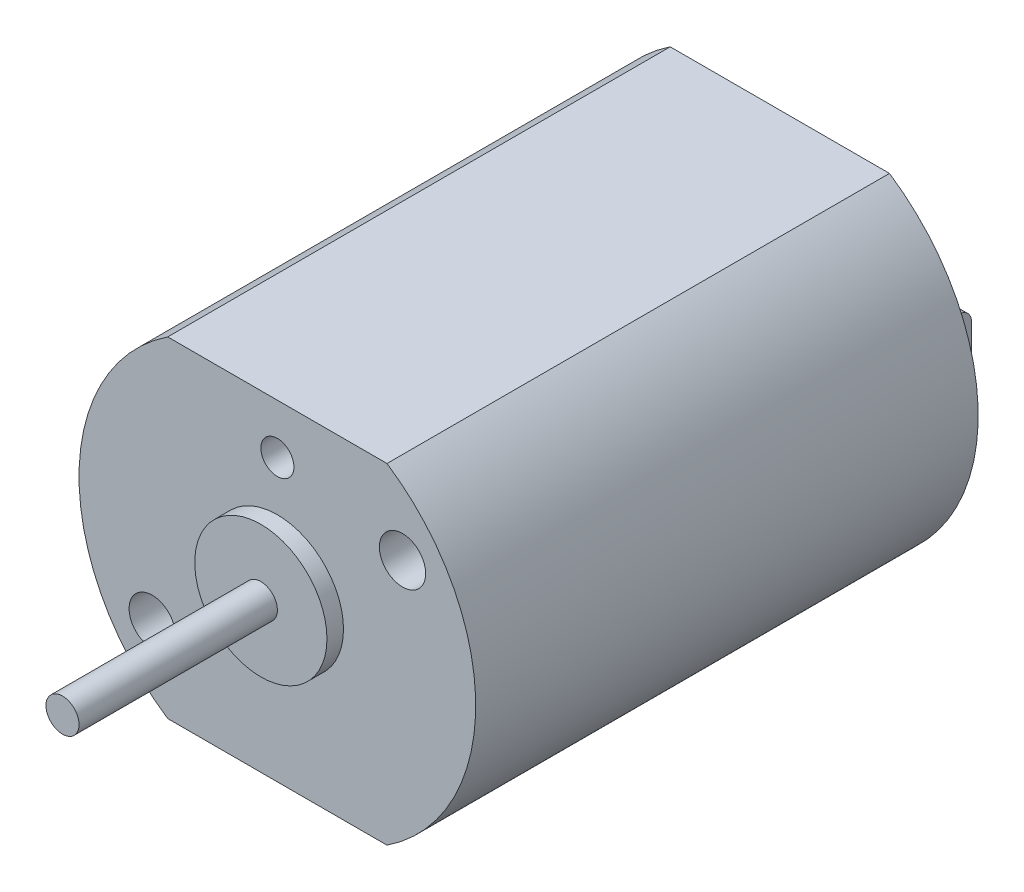
ISO-10303-21;
HEADER;
FILE_DESCRIPTION(('STEP AP214'),'2;1');
FILE_NAME('part.step','',(''),(''),'','','');
FILE_SCHEMA(('AUTOMOTIVE_DESIGN { 1 0 10303 214 1 1 1 1 }'));
ENDSEC;
DATA;
#1=APPLICATION_CONTEXT('core data for automotive mechanical design processes');
#2=APPLICATION_PROTOCOL_DEFINITION('international standard','automotive_design',2000,#1);
#3=PRODUCT_CONTEXT('',#1,'mechanical');
#4=PRODUCT('Part','Part','',(#3));
#5=PRODUCT_RELATED_PRODUCT_CATEGORY('part','',(#4));
#6=PRODUCT_DEFINITION_FORMATION('','',#4);
#7=PRODUCT_DEFINITION_CONTEXT('part definition',#1,'design');
#8=PRODUCT_DEFINITION('design','',#6,#7);
#9=PRODUCT_DEFINITION_SHAPE('','',#8);
#10=(LENGTH_UNIT() NAMED_UNIT(*) SI_UNIT(.MILLI.,.METRE.));
#11=(NAMED_UNIT(*) PLANE_ANGLE_UNIT() SI_UNIT($,.RADIAN.));
#12=(NAMED_UNIT(*) SI_UNIT($,.STERADIAN.) SOLID_ANGLE_UNIT());
#13=UNCERTAINTY_MEASURE_WITH_UNIT(LENGTH_MEASURE(1.E-05),#10,'distance_accuracy_value','');
#14=(GEOMETRIC_REPRESENTATION_CONTEXT(3) GLOBAL_UNCERTAINTY_ASSIGNED_CONTEXT((#13)) GLOBAL_UNIT_ASSIGNED_CONTEXT((#10,
#11,#12)) REPRESENTATION_CONTEXT('',''));
#15=CARTESIAN_POINT('',(0.,0.,0.));
#16=DIRECTION('',(0.,0.,1.));
#17=DIRECTION('',(1.,0.,0.));
#18=AXIS2_PLACEMENT_3D('',#15,#16,#17);
#19=CARTESIAN_POINT('',(0.,5.,15.2));
#20=DIRECTION('',(0.,1.,0.));
#21=DIRECTION('',(0.,0.,1.));
#22=AXIS2_PLACEMENT_3D('',#19,#20,#21);
#23=PLANE('',#22);
#24=DIRECTION('',(1.,0.,0.));
#25=VECTOR('',#24,1.);
#26=CARTESIAN_POINT('',(0.,5.,0.));
#27=LINE('',#26,#25);
#28=CARTESIAN_POINT('',(-3.3166247903554,5.,0.));
#29=VERTEX_POINT('',#28);
#30=CARTESIAN_POINT('',(3.3166247903554,5.,0.));
#31=VERTEX_POINT('',#30);
#32=EDGE_CURVE('E311',#29,#31,#27,.T.);
#33=ORIENTED_EDGE('',*,*,#32,.F.);
#34=DIRECTION('',(0.,0.,-1.));
#35=VECTOR('',#34,1.);
#36=CARTESIAN_POINT('',(-3.3166247903554,5.,15.2));
#37=LINE('',#36,#35);
#38=CARTESIAN_POINT('',(-3.3166247903554,5.,15.2));
#39=VERTEX_POINT('',#38);
#40=EDGE_CURVE('E340',#39,#29,#37,.T.);
#41=ORIENTED_EDGE('',*,*,#40,.F.);
#42=DIRECTION('',(1.,0.,0.));
#43=VECTOR('',#42,1.);
#44=CARTESIAN_POINT('',(0.,5.,15.2));
#45=LINE('',#44,#43);
#46=CARTESIAN_POINT('',(3.3166247903554,5.,15.2));
#47=VERTEX_POINT('',#46);
#48=EDGE_CURVE('E317',#39,#47,#45,.T.);
#49=ORIENTED_EDGE('',*,*,#48,.T.);
#50=DIRECTION('',(0.,0.,-1.));
#51=VECTOR('',#50,1.);
#52=CARTESIAN_POINT('',(3.3166247903554,5.,15.2));
#53=LINE('',#52,#51);
#54=EDGE_CURVE('E332',#47,#31,#53,.T.);
#55=ORIENTED_EDGE('',*,*,#54,.T.);
#56=EDGE_LOOP('',(#33,#41,#49,#55));
#57=FACE_BOUND('',#56,.T.);
#58=ADVANCED_FACE('F39',(#57),#23,.T.);
#59=CARTESIAN_POINT('',(0.,0.,15.2));
#60=DIRECTION('',(0.,0.,-1.));
#61=DIRECTION('',(-1.,0.,0.));
#62=AXIS2_PLACEMENT_3D('',#59,#60,#61);
#63=CYLINDRICAL_SURFACE('',#62,6.);
#64=CARTESIAN_POINT('',(0.,0.,0.));
#65=DIRECTION('',(0.,0.,1.));
#66=DIRECTION('',(1.,0.,0.));
#67=AXIS2_PLACEMENT_3D('',#64,#65,#66);
#68=CIRCLE('',#67,6.);
#69=CARTESIAN_POINT('',(-3.3166247903554,-5.,0.));
#70=VERTEX_POINT('',#69);
#71=EDGE_CURVE('E328',#29,#70,#68,.T.);
#72=ORIENTED_EDGE('',*,*,#71,.T.);
#73=DIRECTION('',(0.,0.,-1.));
#74=VECTOR('',#73,1.);
#75=CARTESIAN_POINT('',(-3.3166247903554,-5.,15.2));
#76=LINE('',#75,#74);
#77=CARTESIAN_POINT('',(-3.3166247903554,-5.,15.2));
#78=VERTEX_POINT('',#77);
#79=EDGE_CURVE('E337',#78,#70,#76,.T.);
#80=ORIENTED_EDGE('',*,*,#79,.F.);
#81=CARTESIAN_POINT('',(0.,0.,15.2));
#82=DIRECTION('',(0.,0.,1.));
#83=DIRECTION('',(1.,0.,0.));
#84=AXIS2_PLACEMENT_3D('',#81,#82,#83);
#85=CIRCLE('',#84,6.);
#86=EDGE_CURVE('E320',#39,#78,#85,.T.);
#87=ORIENTED_EDGE('',*,*,#86,.F.);
#88=ORIENTED_EDGE('',*,*,#40,.T.);
#89=EDGE_LOOP('',(#72,#80,#87,#88));
#90=FACE_BOUND('',#89,.T.);
#91=ADVANCED_FACE('F472',(#90),#63,.T.);
#92=CARTESIAN_POINT('',(0.,-5.,15.2));
#93=DIRECTION('',(0.,1.,0.));
#94=DIRECTION('',(0.,0.,1.));
#95=AXIS2_PLACEMENT_3D('',#92,#93,#94);
#96=PLANE('',#95);
#97=DIRECTION('',(1.,0.,0.));
#98=VECTOR('',#97,1.);
#99=CARTESIAN_POINT('',(0.,-5.,0.));
#100=LINE('',#99,#98);
#101=CARTESIAN_POINT('',(3.3166247903554,-5.,0.));
#102=VERTEX_POINT('',#101);
#103=EDGE_CURVE('E330',#70,#102,#100,.T.);
#104=ORIENTED_EDGE('',*,*,#103,.T.);
#105=DIRECTION('',(0.,0.,-1.));
#106=VECTOR('',#105,1.);
#107=CARTESIAN_POINT('',(3.3166247903554,-5.,15.2));
#108=LINE('',#107,#106);
#109=CARTESIAN_POINT('',(3.3166247903554,-5.,15.2));
#110=VERTEX_POINT('',#109);
#111=EDGE_CURVE('E334',#110,#102,#108,.T.);
#112=ORIENTED_EDGE('',*,*,#111,.F.);
#113=DIRECTION('',(1.,0.,0.));
#114=VECTOR('',#113,1.);
#115=CARTESIAN_POINT('',(0.,-5.,15.2));
#116=LINE('',#115,#114);
#117=EDGE_CURVE('E323',#78,#110,#116,.T.);
#118=ORIENTED_EDGE('',*,*,#117,.F.);
#119=ORIENTED_EDGE('',*,*,#79,.T.);
#120=EDGE_LOOP('',(#104,#112,#118,#119));
#121=FACE_BOUND('',#120,.T.);
#122=ADVANCED_FACE('F477',(#121),#96,.F.);
#123=EDGE_CURVE('E321',#102,#31,#68,.T.);
#124=ORIENTED_EDGE('',*,*,#123,.T.);
#125=ORIENTED_EDGE('',*,*,#54,.F.);
#126=EDGE_CURVE('E324',#110,#47,#85,.T.);
#127=ORIENTED_EDGE('',*,*,#126,.F.);
#128=ORIENTED_EDGE('',*,*,#111,.T.);
#129=EDGE_LOOP('',(#124,#125,#127,#128));
#130=FACE_BOUND('',#129,.T.);
#131=ADVANCED_FACE('F454',(#130),#63,.T.);
#132=CARTESIAN_POINT('',(0.,0.,15.2));
#133=DIRECTION('',(0.,0.,1.));
#134=DIRECTION('',(1.,0.,0.));
#135=AXIS2_PLACEMENT_3D('',#132,#133,#134);
#136=PLANE('',#135);
#137=CARTESIAN_POINT('',(-3.78582883923719,-2.7,15.2));
#138=DIRECTION('',(0.,0.,1.));
#139=DIRECTION('',(1.,0.,0.));
#140=AXIS2_PLACEMENT_3D('',#137,#138,#139);
#141=CIRCLE('',#140,0.700000000000001);
#142=CARTESIAN_POINT('',(-3.08582883923719,-2.7,15.2));
#143=VERTEX_POINT('',#142);
#144=EDGE_CURVE('E435',#143,#143,#141,.T.);
#145=ORIENTED_EDGE('',*,*,#144,.F.);
#146=EDGE_LOOP('',(#145));
#147=FACE_BOUND('',#146,.T.);
#148=CARTESIAN_POINT('',(3.78582883923719,2.7,15.2));
#149=DIRECTION('',(0.,0.,1.));
#150=DIRECTION('',(1.,0.,0.));
#151=AXIS2_PLACEMENT_3D('',#148,#149,#150);
#152=CIRCLE('',#151,0.7);
#153=CARTESIAN_POINT('',(4.48582883923719,2.7,15.2));
#154=VERTEX_POINT('',#153);
#155=EDGE_CURVE('E429',#154,#154,#152,.T.);
#156=ORIENTED_EDGE('',*,*,#155,.F.);
#157=EDGE_LOOP('',(#156));
#158=FACE_BOUND('',#157,.T.);
#159=CARTESIAN_POINT('',(0.,3.5,15.2));
#160=DIRECTION('',(0.,0.,1.));
#161=DIRECTION('',(1.,0.,0.));
#162=AXIS2_PLACEMENT_3D('',#159,#160,#161);
#163=CIRCLE('',#162,0.5);
#164=CARTESIAN_POINT('',(0.5,3.5,15.2));
#165=VERTEX_POINT('',#164);
#166=EDGE_CURVE('E423',#165,#165,#163,.T.);
#167=ORIENTED_EDGE('',*,*,#166,.F.);
#168=EDGE_LOOP('',(#167));
#169=FACE_BOUND('',#168,.T.);
#170=CARTESIAN_POINT('',(0.,0.,15.2));
#171=DIRECTION('',(0.,0.,1.));
#172=DIRECTION('',(1.,0.,0.));
#173=AXIS2_PLACEMENT_3D('',#170,#171,#172);
#174=CIRCLE('',#173,2.);
#175=CARTESIAN_POINT('',(2.,0.,15.2));
#176=VERTEX_POINT('',#175);
#177=EDGE_CURVE('E11',#176,#176,#174,.T.);
#178=ORIENTED_EDGE('',*,*,#177,.F.);
#179=EDGE_LOOP('',(#178));
#180=FACE_BOUND('',#179,.T.);
#181=ORIENTED_EDGE('',*,*,#48,.F.);
#182=ORIENTED_EDGE('',*,*,#86,.T.);
#183=ORIENTED_EDGE('',*,*,#117,.T.);
#184=ORIENTED_EDGE('',*,*,#126,.T.);
#185=EDGE_LOOP('',(#181,#182,#183,#184));
#186=FACE_BOUND('',#185,.T.);
#187=ADVANCED_FACE('F450',(#147,#158,#169,#180,#186),#136,.T.);
#188=CARTESIAN_POINT('',(0.,0.,0.));
#189=DIRECTION('',(0.,0.,1.));
#190=DIRECTION('',(1.,0.,0.));
#191=AXIS2_PLACEMENT_3D('',#188,#189,#190);
#192=PLANE('',#191);
#193=CARTESIAN_POINT('',(0.,0.,0.));
#194=DIRECTION('',(0.,0.,1.));
#195=DIRECTION('',(1.,0.,0.));
#196=AXIS2_PLACEMENT_3D('',#193,#194,#195);
#197=CIRCLE('',#196,2.5);
#198=CARTESIAN_POINT('',(2.5,0.,0.));
#199=VERTEX_POINT('',#198);
#200=EDGE_CURVE('E406',#199,#199,#197,.T.);
#201=ORIENTED_EDGE('',*,*,#200,.T.);
#202=EDGE_LOOP('',(#201));
#203=FACE_BOUND('',#202,.T.);
#204=DIRECTION('',(0.,1.,0.));
#205=VECTOR('',#204,1.);
#206=CARTESIAN_POINT('',(-3.8,-0.75,0.));
#207=LINE('',#206,#205);
#208=CARTESIAN_POINT('',(-3.8,-0.75,0.));
#209=VERTEX_POINT('',#208);
#210=CARTESIAN_POINT('',(-3.8,0.75,0.));
#211=VERTEX_POINT('',#210);
#212=EDGE_CURVE('E273',#209,#211,#207,.T.);
#213=ORIENTED_EDGE('',*,*,#212,.F.);
#214=DIRECTION('',(1.,0.,0.));
#215=VECTOR('',#214,1.);
#216=CARTESIAN_POINT('',(-3.8,-0.75,0.));
#217=LINE('',#216,#215);
#218=CARTESIAN_POINT('',(-3.5,-0.75,0.));
#219=VERTEX_POINT('',#218);
#220=EDGE_CURVE('E283',#209,#219,#217,.T.);
#221=ORIENTED_EDGE('',*,*,#220,.T.);
#222=DIRECTION('',(0.,1.,0.));
#223=VECTOR('',#222,1.);
#224=CARTESIAN_POINT('',(-3.5,-0.75,0.));
#225=LINE('',#224,#223);
#226=CARTESIAN_POINT('',(-3.5,0.75,0.));
#227=VERTEX_POINT('',#226);
#228=EDGE_CURVE('E280',#219,#227,#225,.T.);
#229=ORIENTED_EDGE('',*,*,#228,.T.);
#230=DIRECTION('',(1.,0.,0.));
#231=VECTOR('',#230,1.);
#232=CARTESIAN_POINT('',(-3.8,0.75,0.));
#233=LINE('',#232,#231);
#234=EDGE_CURVE('E276',#211,#227,#233,.T.);
#235=ORIENTED_EDGE('',*,*,#234,.F.);
#236=EDGE_LOOP('',(#213,#221,#229,#235));
#237=FACE_BOUND('',#236,.T.);
#238=DIRECTION('',(0.,1.,0.));
#239=VECTOR('',#238,1.);
#240=CARTESIAN_POINT('',(3.5,-0.75,0.));
#241=LINE('',#240,#239);
#242=CARTESIAN_POINT('',(3.5,-0.75,0.));
#243=VERTEX_POINT('',#242);
#244=CARTESIAN_POINT('',(3.5,0.75,0.));
#245=VERTEX_POINT('',#244);
#246=EDGE_CURVE('E295',#243,#245,#241,.T.);
#247=ORIENTED_EDGE('',*,*,#246,.F.);
#248=DIRECTION('',(1.,0.,0.));
#249=VECTOR('',#248,1.);
#250=CARTESIAN_POINT('',(3.5,-0.75,0.));
#251=LINE('',#250,#249);
#252=CARTESIAN_POINT('',(3.8,-0.75,0.));
#253=VERTEX_POINT('',#252);
#254=EDGE_CURVE('E286',#243,#253,#251,.T.);
#255=ORIENTED_EDGE('',*,*,#254,.T.);
#256=DIRECTION('',(0.,1.,0.));
#257=VECTOR('',#256,1.);
#258=CARTESIAN_POINT('',(3.8,-0.75,0.));
#259=LINE('',#258,#257);
#260=CARTESIAN_POINT('',(3.8,0.75,0.));
#261=VERTEX_POINT('',#260);
#262=EDGE_CURVE('E301',#253,#261,#259,.T.);
#263=ORIENTED_EDGE('',*,*,#262,.T.);
#264=DIRECTION('',(1.,0.,0.));
#265=VECTOR('',#264,1.);
#266=CARTESIAN_POINT('',(3.5,0.75,0.));
#267=LINE('',#266,#265);
#268=EDGE_CURVE('E304',#245,#261,#267,.T.);
#269=ORIENTED_EDGE('',*,*,#268,.F.);
#270=EDGE_LOOP('',(#247,#255,#263,#269));
#271=FACE_BOUND('',#270,.T.);
#272=ORIENTED_EDGE('',*,*,#32,.T.);
#273=ORIENTED_EDGE('',*,*,#123,.F.);
#274=ORIENTED_EDGE('',*,*,#103,.F.);
#275=ORIENTED_EDGE('',*,*,#71,.F.);
#276=EDGE_LOOP('',(#272,#273,#274,#275));
#277=FACE_BOUND('',#276,.T.);
#278=ADVANCED_FACE('F453',(#203,#237,#271,#277),#192,.F.);
#279=CARTESIAN_POINT('',(3.5,-0.75,-2.));
#280=DIRECTION('',(0.,-1.,0.));
#281=DIRECTION('',(0.,0.,-1.));
#282=AXIS2_PLACEMENT_3D('',#279,#280,#281);
#283=PLANE('',#282);
#284=DIRECTION('',(0.,0.,1.));
#285=VECTOR('',#284,1.);
#286=CARTESIAN_POINT('',(3.5,-0.75,-2.));
#287=LINE('',#286,#285);
#288=CARTESIAN_POINT('',(3.5,-0.75,-1.6));
#289=VERTEX_POINT('',#288);
#290=EDGE_CURVE('E309',#289,#243,#287,.T.);
#291=ORIENTED_EDGE('',*,*,#290,.F.);
#292=DIRECTION('',(1.,0.,0.));
#293=VECTOR('',#292,1.);
#294=CARTESIAN_POINT('',(3.8,-0.75,-1.6));
#295=LINE('',#294,#293);
#296=CARTESIAN_POINT('',(3.8,-0.75,-1.6));
#297=VERTEX_POINT('',#296);
#298=EDGE_CURVE('E382',#289,#297,#295,.T.);
#299=ORIENTED_EDGE('',*,*,#298,.T.);
#300=DIRECTION('',(0.,0.,1.));
#301=VECTOR('',#300,1.);
#302=CARTESIAN_POINT('',(3.8,-0.75,-2.));
#303=LINE('',#302,#301);
#304=EDGE_CURVE('E298',#297,#253,#303,.T.);
#305=ORIENTED_EDGE('',*,*,#304,.T.);
#306=ORIENTED_EDGE('',*,*,#254,.F.);
#307=EDGE_LOOP('',(#291,#299,#305,#306));
#308=FACE_BOUND('',#307,.T.);
#309=ADVANCED_FACE('F482',(#308),#283,.T.);
#310=CARTESIAN_POINT('',(3.5,-0.75,-2.));
#311=DIRECTION('',(1.,0.,0.));
#312=DIRECTION('',(0.,0.,-1.));
#313=AXIS2_PLACEMENT_3D('',#310,#311,#312);
#314=PLANE('',#313);
#315=DIRECTION('',(0.,0.,1.));
#316=VECTOR('',#315,1.);
#317=CARTESIAN_POINT('',(3.5,0.449999999999999,-2.));
#318=LINE('',#317,#316);
#319=CARTESIAN_POINT('',(3.5,0.45,-1.05));
#320=VERTEX_POINT('',#319);
#321=CARTESIAN_POINT('',(3.5,0.45,-0.95));
#322=VERTEX_POINT('',#321);
#323=EDGE_CURVE('E255',#320,#322,#318,.T.);
#324=ORIENTED_EDGE('',*,*,#323,.T.);
#325=CARTESIAN_POINT('',(3.5,0.,-0.95));
#326=DIRECTION('',(1.,0.,0.));
#327=DIRECTION('',(0.,0.,-1.));
#328=AXIS2_PLACEMENT_3D('',#325,#326,#327);
#329=CIRCLE('',#328,0.45);
#330=CARTESIAN_POINT('',(3.5,-0.45,-0.95));
#331=VERTEX_POINT('',#330);
#332=EDGE_CURVE('E261',#322,#331,#329,.T.);
#333=ORIENTED_EDGE('',*,*,#332,.T.);
#334=DIRECTION('',(0.,0.,-1.));
#335=VECTOR('',#334,1.);
#336=CARTESIAN_POINT('',(3.5,-0.45,-2.));
#337=LINE('',#336,#335);
#338=CARTESIAN_POINT('',(3.5,-0.45,-1.05));
#339=VERTEX_POINT('',#338);
#340=EDGE_CURVE('E246',#331,#339,#337,.T.);
#341=ORIENTED_EDGE('',*,*,#340,.T.);
#342=CARTESIAN_POINT('',(3.5,0.,-1.05));
#343=DIRECTION('',(1.,0.,0.));
#344=DIRECTION('',(0.,0.,-1.));
#345=AXIS2_PLACEMENT_3D('',#342,#343,#344);
#346=CIRCLE('',#345,0.45);
#347=EDGE_CURVE('E212',#339,#320,#346,.T.);
#348=ORIENTED_EDGE('',*,*,#347,.T.);
#349=EDGE_LOOP('',(#324,#333,#341,#348));
#350=FACE_BOUND('',#349,.T.);
#351=DIRECTION('',(0.,0.,1.));
#352=VECTOR('',#351,1.);
#353=CARTESIAN_POINT('',(3.5,0.75,-2.));
#354=LINE('',#353,#352);
#355=CARTESIAN_POINT('',(3.5,0.75,-1.6));
#356=VERTEX_POINT('',#355);
#357=EDGE_CURVE('E312',#356,#245,#354,.T.);
#358=ORIENTED_EDGE('',*,*,#357,.F.);
#359=CARTESIAN_POINT('',(3.5,0.35,-1.6));
#360=DIRECTION('',(1.,0.,0.));
#361=DIRECTION('',(0.,0.,-1.));
#362=AXIS2_PLACEMENT_3D('',#359,#360,#361);
#363=CIRCLE('',#362,0.4);
#364=CARTESIAN_POINT('',(3.5,0.35,-2.));
#365=VERTEX_POINT('',#364);
#366=EDGE_CURVE('E380',#356,#365,#363,.F.);
#367=ORIENTED_EDGE('',*,*,#366,.T.);
#368=DIRECTION('',(0.,1.,0.));
#369=VECTOR('',#368,1.);
#370=CARTESIAN_POINT('',(3.5,-0.75,-2.));
#371=LINE('',#370,#369);
#372=CARTESIAN_POINT('',(3.5,-0.35,-2.));
#373=VERTEX_POINT('',#372);
#374=EDGE_CURVE('E294',#373,#365,#371,.T.);
#375=ORIENTED_EDGE('',*,*,#374,.F.);
#376=CARTESIAN_POINT('',(3.5,-0.35,-1.6));
#377=DIRECTION('',(1.,0.,0.));
#378=DIRECTION('',(0.,0.,-1.));
#379=AXIS2_PLACEMENT_3D('',#376,#377,#378);
#380=CIRCLE('',#379,0.4);
#381=EDGE_CURVE('E56',#373,#289,#380,.F.);
#382=ORIENTED_EDGE('',*,*,#381,.T.);
#383=ORIENTED_EDGE('',*,*,#290,.T.);
#384=ORIENTED_EDGE('',*,*,#246,.T.);
#385=EDGE_LOOP('',(#358,#367,#375,#382,#383,#384));
#386=FACE_BOUND('',#385,.T.);
#387=ADVANCED_FACE('F487',(#350,#386),#314,.F.);
#388=CARTESIAN_POINT('',(3.5,0.75,-2.));
#389=DIRECTION('',(0.,-1.,0.));
#390=DIRECTION('',(0.,0.,-1.));
#391=AXIS2_PLACEMENT_3D('',#388,#389,#390);
#392=PLANE('',#391);
#393=DIRECTION('',(0.,0.,1.));
#394=VECTOR('',#393,1.);
#395=CARTESIAN_POINT('',(3.8,0.75,-2.));
#396=LINE('',#395,#394);
#397=CARTESIAN_POINT('',(3.8,0.75,-1.6));
#398=VERTEX_POINT('',#397);
#399=EDGE_CURVE('E314',#398,#261,#396,.T.);
#400=ORIENTED_EDGE('',*,*,#399,.F.);
#401=DIRECTION('',(1.,0.,0.));
#402=VECTOR('',#401,1.);
#403=CARTESIAN_POINT('',(3.5,0.75,-1.6));
#404=LINE('',#403,#402);
#405=EDGE_CURVE('E64',#398,#356,#404,.F.);
#406=ORIENTED_EDGE('',*,*,#405,.T.);
#407=ORIENTED_EDGE('',*,*,#357,.T.);
#408=ORIENTED_EDGE('',*,*,#268,.T.);
#409=EDGE_LOOP('',(#400,#406,#407,#408));
#410=FACE_BOUND('',#409,.T.);
#411=ADVANCED_FACE('F527',(#410),#392,.F.);
#412=CARTESIAN_POINT('',(3.8,-0.75,-2.));
#413=DIRECTION('',(1.,0.,0.));
#414=DIRECTION('',(0.,0.,-1.));
#415=AXIS2_PLACEMENT_3D('',#412,#413,#414);
#416=PLANE('',#415);
#417=CARTESIAN_POINT('',(3.8,0.,-0.95));
#418=DIRECTION('',(1.,0.,0.));
#419=DIRECTION('',(0.,0.,-1.));
#420=AXIS2_PLACEMENT_3D('',#417,#418,#419);
#421=CIRCLE('',#420,0.45);
#422=CARTESIAN_POINT('',(3.8,0.45,-0.95));
#423=VERTEX_POINT('',#422);
#424=CARTESIAN_POINT('',(3.8,-0.45,-0.95));
#425=VERTEX_POINT('',#424);
#426=EDGE_CURVE('E226',#423,#425,#421,.T.);
#427=ORIENTED_EDGE('',*,*,#426,.F.);
#428=DIRECTION('',(0.,0.,1.));
#429=VECTOR('',#428,1.);
#430=CARTESIAN_POINT('',(3.8,0.45,-0.95));
#431=LINE('',#430,#429);
#432=CARTESIAN_POINT('',(3.8,0.45,-1.05));
#433=VERTEX_POINT('',#432);
#434=EDGE_CURVE('E231',#433,#423,#431,.T.);
#435=ORIENTED_EDGE('',*,*,#434,.F.);
#436=CARTESIAN_POINT('',(3.8,0.,-1.05));
#437=DIRECTION('',(1.,0.,0.));
#438=DIRECTION('',(0.,0.,-1.));
#439=AXIS2_PLACEMENT_3D('',#436,#437,#438);
#440=CIRCLE('',#439,0.45);
#441=CARTESIAN_POINT('',(3.8,-0.45,-1.05));
#442=VERTEX_POINT('',#441);
#443=EDGE_CURVE('E209',#442,#433,#440,.T.);
#444=ORIENTED_EDGE('',*,*,#443,.F.);
#445=DIRECTION('',(0.,0.,-1.));
#446=VECTOR('',#445,1.);
#447=CARTESIAN_POINT('',(3.8,-0.45,-0.95));
#448=LINE('',#447,#446);
#449=EDGE_CURVE('E220',#425,#442,#448,.T.);
#450=ORIENTED_EDGE('',*,*,#449,.F.);
#451=EDGE_LOOP('',(#427,#435,#444,#450));
#452=FACE_BOUND('',#451,.T.);
#453=DIRECTION('',(0.,1.,0.));
#454=VECTOR('',#453,1.);
#455=CARTESIAN_POINT('',(3.8,-0.75,-2.));
#456=LINE('',#455,#454);
#457=CARTESIAN_POINT('',(3.8,-0.35,-2.));
#458=VERTEX_POINT('',#457);
#459=CARTESIAN_POINT('',(3.8,0.35,-2.));
#460=VERTEX_POINT('',#459);
#461=EDGE_CURVE('E291',#458,#460,#456,.T.);
#462=ORIENTED_EDGE('',*,*,#461,.T.);
#463=CARTESIAN_POINT('',(3.8,0.35,-1.6));
#464=DIRECTION('',(1.,0.,0.));
#465=DIRECTION('',(0.,0.,-1.));
#466=AXIS2_PLACEMENT_3D('',#463,#464,#465);
#467=CIRCLE('',#466,0.4);
#468=EDGE_CURVE('E376',#460,#398,#467,.T.);
#469=ORIENTED_EDGE('',*,*,#468,.T.);
#470=ORIENTED_EDGE('',*,*,#399,.T.);
#471=ORIENTED_EDGE('',*,*,#262,.F.);
#472=ORIENTED_EDGE('',*,*,#304,.F.);
#473=CARTESIAN_POINT('',(3.8,-0.35,-1.6));
#474=DIRECTION('',(1.,0.,0.));
#475=DIRECTION('',(0.,0.,-1.));
#476=AXIS2_PLACEMENT_3D('',#473,#474,#475);
#477=CIRCLE('',#476,0.4);
#478=EDGE_CURVE('E374',#297,#458,#477,.T.);
#479=ORIENTED_EDGE('',*,*,#478,.T.);
#480=EDGE_LOOP('',(#462,#469,#470,#471,#472,#479));
#481=FACE_BOUND('',#480,.T.);
#482=ADVANCED_FACE('F228',(#452,#481),#416,.T.);
#483=CARTESIAN_POINT('',(0.,0.,-2.));
#484=DIRECTION('',(0.,0.,1.));
#485=DIRECTION('',(1.,0.,0.));
#486=AXIS2_PLACEMENT_3D('',#483,#484,#485);
#487=PLANE('',#486);
#488=ORIENTED_EDGE('',*,*,#374,.T.);
#489=DIRECTION('',(1.,0.,0.));
#490=VECTOR('',#489,1.);
#491=CARTESIAN_POINT('',(0.,0.35,-2.));
#492=LINE('',#491,#490);
#493=EDGE_CURVE('E371',#365,#460,#492,.T.);
#494=ORIENTED_EDGE('',*,*,#493,.T.);
#495=ORIENTED_EDGE('',*,*,#461,.F.);
#496=DIRECTION('',(1.,0.,0.));
#497=VECTOR('',#496,1.);
#498=CARTESIAN_POINT('',(3.5,-0.35,-2.));
#499=LINE('',#498,#497);
#500=EDGE_CURVE('E369',#458,#373,#499,.F.);
#501=ORIENTED_EDGE('',*,*,#500,.T.);
#502=EDGE_LOOP('',(#488,#494,#495,#501));
#503=FACE_BOUND('',#502,.T.);
#504=ADVANCED_FACE('F526',(#503),#487,.F.);
#505=CARTESIAN_POINT('',(-3.8,-0.75,-2.));
#506=DIRECTION('',(0.,-1.,0.));
#507=DIRECTION('',(0.,0.,-1.));
#508=AXIS2_PLACEMENT_3D('',#505,#506,#507);
#509=PLANE('',#508);
#510=DIRECTION('',(0.,0.,1.));
#511=VECTOR('',#510,1.);
#512=CARTESIAN_POINT('',(-3.8,-0.75,-2.));
#513=LINE('',#512,#511);
#514=CARTESIAN_POINT('',(-3.8,-0.75,-1.6));
#515=VERTEX_POINT('',#514);
#516=EDGE_CURVE('E264',#515,#209,#513,.T.);
#517=ORIENTED_EDGE('',*,*,#516,.F.);
#518=DIRECTION('',(1.,0.,0.));
#519=VECTOR('',#518,1.);
#520=CARTESIAN_POINT('',(-3.5,-0.75,-1.6));
#521=LINE('',#520,#519);
#522=CARTESIAN_POINT('',(-3.5,-0.75,-1.6));
#523=VERTEX_POINT('',#522);
#524=EDGE_CURVE('E366',#515,#523,#521,.T.);
#525=ORIENTED_EDGE('',*,*,#524,.T.);
#526=DIRECTION('',(0.,0.,1.));
#527=VECTOR('',#526,1.);
#528=CARTESIAN_POINT('',(-3.5,-0.75,-2.));
#529=LINE('',#528,#527);
#530=EDGE_CURVE('E265',#523,#219,#529,.T.);
#531=ORIENTED_EDGE('',*,*,#530,.T.);
#532=ORIENTED_EDGE('',*,*,#220,.F.);
#533=EDGE_LOOP('',(#517,#525,#531,#532));
#534=FACE_BOUND('',#533,.T.);
#535=ADVANCED_FACE('F540',(#534),#509,.T.);
#536=CARTESIAN_POINT('',(-3.8,-0.75,-2.));
#537=DIRECTION('',(1.,0.,0.));
#538=DIRECTION('',(0.,0.,-1.));
#539=AXIS2_PLACEMENT_3D('',#536,#537,#538);
#540=PLANE('',#539);
#541=DIRECTION('',(0.,0.,1.));
#542=VECTOR('',#541,1.);
#543=CARTESIAN_POINT('',(-3.8,0.449999999999999,-2.));
#544=LINE('',#543,#542);
#545=CARTESIAN_POINT('',(-3.8,0.45,-1.05));
#546=VERTEX_POINT('',#545);
#547=CARTESIAN_POINT('',(-3.8,0.45,-0.95));
#548=VERTEX_POINT('',#547);
#549=EDGE_CURVE('E252',#546,#548,#544,.T.);
#550=ORIENTED_EDGE('',*,*,#549,.T.);
#551=CARTESIAN_POINT('',(-3.8,0.,-0.95));
#552=DIRECTION('',(1.,0.,0.));
#553=DIRECTION('',(0.,0.,-1.));
#554=AXIS2_PLACEMENT_3D('',#551,#552,#553);
#555=CIRCLE('',#554,0.45);
#556=CARTESIAN_POINT('',(-3.8,-0.45,-0.95));
#557=VERTEX_POINT('',#556);
#558=EDGE_CURVE('E258',#548,#557,#555,.T.);
#559=ORIENTED_EDGE('',*,*,#558,.T.);
#560=DIRECTION('',(0.,0.,-1.));
#561=VECTOR('',#560,1.);
#562=CARTESIAN_POINT('',(-3.8,-0.45,-2.));
#563=LINE('',#562,#561);
#564=CARTESIAN_POINT('',(-3.8,-0.45,-1.05));
#565=VERTEX_POINT('',#564);
#566=EDGE_CURVE('E243',#557,#565,#563,.T.);
#567=ORIENTED_EDGE('',*,*,#566,.T.);
#568=CARTESIAN_POINT('',(-3.8,0.,-1.05));
#569=DIRECTION('',(1.,0.,0.));
#570=DIRECTION('',(0.,0.,-1.));
#571=AXIS2_PLACEMENT_3D('',#568,#569,#570);
#572=CIRCLE('',#571,0.45);
#573=EDGE_CURVE('E248',#565,#546,#572,.T.);
#574=ORIENTED_EDGE('',*,*,#573,.T.);
#575=EDGE_LOOP('',(#550,#559,#567,#574));
#576=FACE_BOUND('',#575,.T.);
#577=DIRECTION('',(0.,0.,1.));
#578=VECTOR('',#577,1.);
#579=CARTESIAN_POINT('',(-3.8,0.75,-2.));
#580=LINE('',#579,#578);
#581=CARTESIAN_POINT('',(-3.8,0.75,-1.6));
#582=VERTEX_POINT('',#581);
#583=EDGE_CURVE('E270',#582,#211,#580,.T.);
#584=ORIENTED_EDGE('',*,*,#583,.F.);
#585=CARTESIAN_POINT('',(-3.8,0.35,-1.6));
#586=DIRECTION('',(1.,0.,0.));
#587=DIRECTION('',(0.,0.,-1.));
#588=AXIS2_PLACEMENT_3D('',#585,#586,#587);
#589=CIRCLE('',#588,0.4);
#590=CARTESIAN_POINT('',(-3.8,0.35,-2.));
#591=VERTEX_POINT('',#590);
#592=EDGE_CURVE('E364',#582,#591,#589,.F.);
#593=ORIENTED_EDGE('',*,*,#592,.T.);
#594=DIRECTION('',(0.,1.,0.));
#595=VECTOR('',#594,1.);
#596=CARTESIAN_POINT('',(-3.8,-0.75,-2.));
#597=LINE('',#596,#595);
#598=CARTESIAN_POINT('',(-3.8,-0.35,-2.));
#599=VERTEX_POINT('',#598);
#600=EDGE_CURVE('E267',#599,#591,#597,.T.);
#601=ORIENTED_EDGE('',*,*,#600,.F.);
#602=CARTESIAN_POINT('',(-3.8,-0.35,-1.6));
#603=DIRECTION('',(1.,0.,0.));
#604=DIRECTION('',(0.,0.,-1.));
#605=AXIS2_PLACEMENT_3D('',#602,#603,#604);
#606=CIRCLE('',#605,0.4);
#607=EDGE_CURVE('E362',#599,#515,#606,.F.);
#608=ORIENTED_EDGE('',*,*,#607,.T.);
#609=ORIENTED_EDGE('',*,*,#516,.T.);
#610=ORIENTED_EDGE('',*,*,#212,.T.);
#611=EDGE_LOOP('',(#584,#593,#601,#608,#609,#610));
#612=FACE_BOUND('',#611,.T.);
#613=ADVANCED_FACE('F547',(#576,#612),#540,.F.);
#614=CARTESIAN_POINT('',(-3.8,0.75,-2.));
#615=DIRECTION('',(0.,-1.,0.));
#616=DIRECTION('',(0.,0.,-1.));
#617=AXIS2_PLACEMENT_3D('',#614,#615,#616);
#618=PLANE('',#617);
#619=DIRECTION('',(0.,0.,1.));
#620=VECTOR('',#619,1.);
#621=CARTESIAN_POINT('',(-3.5,0.75,-2.));
#622=LINE('',#621,#620);
#623=CARTESIAN_POINT('',(-3.5,0.75,-1.6));
#624=VERTEX_POINT('',#623);
#625=EDGE_CURVE('E268',#624,#227,#622,.T.);
#626=ORIENTED_EDGE('',*,*,#625,.F.);
#627=DIRECTION('',(1.,0.,0.));
#628=VECTOR('',#627,1.);
#629=CARTESIAN_POINT('',(-3.8,0.75,-1.6));
#630=LINE('',#629,#628);
#631=EDGE_CURVE('E360',#624,#582,#630,.F.);
#632=ORIENTED_EDGE('',*,*,#631,.T.);
#633=ORIENTED_EDGE('',*,*,#583,.T.);
#634=ORIENTED_EDGE('',*,*,#234,.T.);
#635=EDGE_LOOP('',(#626,#632,#633,#634));
#636=FACE_BOUND('',#635,.T.);
#637=ADVANCED_FACE('F550',(#636),#618,.F.);
#638=CARTESIAN_POINT('',(-3.5,-0.75,-2.));
#639=DIRECTION('',(1.,0.,0.));
#640=DIRECTION('',(0.,0.,-1.));
#641=AXIS2_PLACEMENT_3D('',#638,#639,#640);
#642=PLANE('',#641);
#643=CARTESIAN_POINT('',(-3.5,0.,-0.95));
#644=DIRECTION('',(1.,0.,0.));
#645=DIRECTION('',(0.,0.,-1.));
#646=AXIS2_PLACEMENT_3D('',#643,#644,#645);
#647=CIRCLE('',#646,0.45);
#648=CARTESIAN_POINT('',(-3.5,0.45,-0.95));
#649=VERTEX_POINT('',#648);
#650=CARTESIAN_POINT('',(-3.5,-0.45,-0.95));
#651=VERTEX_POINT('',#650);
#652=EDGE_CURVE('E348',#649,#651,#647,.T.);
#653=ORIENTED_EDGE('',*,*,#652,.F.);
#654=DIRECTION('',(0.,0.,1.));
#655=VECTOR('',#654,1.);
#656=CARTESIAN_POINT('',(-3.5,0.449999999999999,-2.));
#657=LINE('',#656,#655);
#658=CARTESIAN_POINT('',(-3.5,0.45,-1.05));
#659=VERTEX_POINT('',#658);
#660=EDGE_CURVE('E346',#659,#649,#657,.T.);
#661=ORIENTED_EDGE('',*,*,#660,.F.);
#662=CARTESIAN_POINT('',(-3.5,0.,-1.05));
#663=DIRECTION('',(1.,0.,0.));
#664=DIRECTION('',(0.,0.,-1.));
#665=AXIS2_PLACEMENT_3D('',#662,#663,#664);
#666=CIRCLE('',#665,0.45);
#667=CARTESIAN_POINT('',(-3.5,-0.45,-1.05));
#668=VERTEX_POINT('',#667);
#669=EDGE_CURVE('E344',#668,#659,#666,.T.);
#670=ORIENTED_EDGE('',*,*,#669,.F.);
#671=DIRECTION('',(0.,0.,-1.));
#672=VECTOR('',#671,1.);
#673=CARTESIAN_POINT('',(-3.5,-0.45,-2.));
#674=LINE('',#673,#672);
#675=EDGE_CURVE('E342',#651,#668,#674,.T.);
#676=ORIENTED_EDGE('',*,*,#675,.F.);
#677=EDGE_LOOP('',(#653,#661,#670,#676));
#678=FACE_BOUND('',#677,.T.);
#679=DIRECTION('',(0.,1.,0.));
#680=VECTOR('',#679,1.);
#681=CARTESIAN_POINT('',(-3.5,-0.75,-2.));
#682=LINE('',#681,#680);
#683=CARTESIAN_POINT('',(-3.5,-0.35,-2.));
#684=VERTEX_POINT('',#683);
#685=CARTESIAN_POINT('',(-3.5,0.35,-2.));
#686=VERTEX_POINT('',#685);
#687=EDGE_CURVE('E277',#684,#686,#682,.T.);
#688=ORIENTED_EDGE('',*,*,#687,.T.);
#689=CARTESIAN_POINT('',(-3.5,0.35,-1.6));
#690=DIRECTION('',(1.,0.,0.));
#691=DIRECTION('',(0.,0.,-1.));
#692=AXIS2_PLACEMENT_3D('',#689,#690,#691);
#693=CIRCLE('',#692,0.4);
#694=EDGE_CURVE('E358',#686,#624,#693,.T.);
#695=ORIENTED_EDGE('',*,*,#694,.T.);
#696=ORIENTED_EDGE('',*,*,#625,.T.);
#697=ORIENTED_EDGE('',*,*,#228,.F.);
#698=ORIENTED_EDGE('',*,*,#530,.F.);
#699=CARTESIAN_POINT('',(-3.5,-0.35,-1.6));
#700=DIRECTION('',(1.,0.,0.));
#701=DIRECTION('',(0.,0.,-1.));
#702=AXIS2_PLACEMENT_3D('',#699,#700,#701);
#703=CIRCLE('',#702,0.4);
#704=EDGE_CURVE('E356',#523,#684,#703,.T.);
#705=ORIENTED_EDGE('',*,*,#704,.T.);
#706=EDGE_LOOP('',(#688,#695,#696,#697,#698,#705));
#707=FACE_BOUND('',#706,.T.);
#708=ADVANCED_FACE('F545',(#678,#707),#642,.T.);
#709=CARTESIAN_POINT('',(0.,0.,-2.));
#710=DIRECTION('',(0.,0.,1.));
#711=DIRECTION('',(1.,0.,0.));
#712=AXIS2_PLACEMENT_3D('',#709,#710,#711);
#713=PLANE('',#712);
#714=ORIENTED_EDGE('',*,*,#600,.T.);
#715=DIRECTION('',(1.,0.,0.));
#716=VECTOR('',#715,1.);
#717=CARTESIAN_POINT('',(0.,0.35,-2.));
#718=LINE('',#717,#716);
#719=EDGE_CURVE('E353',#591,#686,#718,.T.);
#720=ORIENTED_EDGE('',*,*,#719,.T.);
#721=ORIENTED_EDGE('',*,*,#687,.F.);
#722=DIRECTION('',(1.,0.,0.));
#723=VECTOR('',#722,1.);
#724=CARTESIAN_POINT('',(-3.8,-0.35,-2.));
#725=LINE('',#724,#723);
#726=EDGE_CURVE('E351',#684,#599,#725,.F.);
#727=ORIENTED_EDGE('',*,*,#726,.T.);
#728=EDGE_LOOP('',(#714,#720,#721,#727));
#729=FACE_BOUND('',#728,.T.);
#730=ADVANCED_FACE('F541',(#729),#713,.F.);
#731=CARTESIAN_POINT('',(-6.,-0.45,-0.95));
#732=DIRECTION('',(0.,-1.,0.));
#733=DIRECTION('',(0.,0.,-1.));
#734=AXIS2_PLACEMENT_3D('',#731,#732,#733);
#735=PLANE('',#734);
#736=DIRECTION('',(1.,0.,0.));
#737=VECTOR('',#736,1.);
#738=CARTESIAN_POINT('',(-6.,-0.45,-0.95));
#739=LINE('',#738,#737);
#740=EDGE_CURVE('E216',#557,#651,#739,.T.);
#741=ORIENTED_EDGE('',*,*,#740,.T.);
#742=ORIENTED_EDGE('',*,*,#675,.T.);
#743=DIRECTION('',(1.,0.,0.));
#744=VECTOR('',#743,1.);
#745=CARTESIAN_POINT('',(-6.,-0.45,-1.05));
#746=LINE('',#745,#744);
#747=EDGE_CURVE('E215',#565,#668,#746,.T.);
#748=ORIENTED_EDGE('',*,*,#747,.F.);
#749=ORIENTED_EDGE('',*,*,#566,.F.);
#750=EDGE_LOOP('',(#741,#742,#748,#749));
#751=FACE_BOUND('',#750,.T.);
#752=ADVANCED_FACE('F544',(#751),#735,.F.);
#753=CARTESIAN_POINT('',(-6.,0.,-1.05));
#754=DIRECTION('',(1.,0.,0.));
#755=DIRECTION('',(0.,0.,-1.));
#756=AXIS2_PLACEMENT_3D('',#753,#754,#755);
#757=CYLINDRICAL_SURFACE('',#756,0.45);
#758=ORIENTED_EDGE('',*,*,#747,.T.);
#759=ORIENTED_EDGE('',*,*,#669,.T.);
#760=DIRECTION('',(1.,0.,0.));
#761=VECTOR('',#760,1.);
#762=CARTESIAN_POINT('',(-6.,0.45,-1.05));
#763=LINE('',#762,#761);
#764=EDGE_CURVE('E239',#546,#659,#763,.T.);
#765=ORIENTED_EDGE('',*,*,#764,.F.);
#766=ORIENTED_EDGE('',*,*,#573,.F.);
#767=EDGE_LOOP('',(#758,#759,#765,#766));
#768=FACE_BOUND('',#767,.T.);
#769=ADVANCED_FACE('F571',(#768),#757,.F.);
#770=CARTESIAN_POINT('',(-6.,0.45,-0.95));
#771=DIRECTION('',(0.,1.,0.));
#772=DIRECTION('',(0.,0.,1.));
#773=AXIS2_PLACEMENT_3D('',#770,#771,#772);
#774=PLANE('',#773);
#775=ORIENTED_EDGE('',*,*,#764,.T.);
#776=ORIENTED_EDGE('',*,*,#660,.T.);
#777=DIRECTION('',(1.,0.,0.));
#778=VECTOR('',#777,1.);
#779=CARTESIAN_POINT('',(-6.,0.45,-0.95));
#780=LINE('',#779,#778);
#781=EDGE_CURVE('E238',#548,#649,#780,.T.);
#782=ORIENTED_EDGE('',*,*,#781,.F.);
#783=ORIENTED_EDGE('',*,*,#549,.F.);
#784=EDGE_LOOP('',(#775,#776,#782,#783));
#785=FACE_BOUND('',#784,.T.);
#786=ADVANCED_FACE('F574',(#785),#774,.F.);
#787=CARTESIAN_POINT('',(-6.,0.,-0.95));
#788=DIRECTION('',(1.,0.,0.));
#789=DIRECTION('',(0.,0.,-1.));
#790=AXIS2_PLACEMENT_3D('',#787,#788,#789);
#791=CYLINDRICAL_SURFACE('',#790,0.45);
#792=ORIENTED_EDGE('',*,*,#781,.T.);
#793=ORIENTED_EDGE('',*,*,#652,.T.);
#794=ORIENTED_EDGE('',*,*,#740,.F.);
#795=ORIENTED_EDGE('',*,*,#558,.F.);
#796=EDGE_LOOP('',(#792,#793,#794,#795));
#797=FACE_BOUND('',#796,.T.);
#798=ADVANCED_FACE('F565',(#797),#791,.F.);
#799=EDGE_CURVE('E236',#322,#423,#780,.T.);
#800=ORIENTED_EDGE('',*,*,#799,.T.);
#801=ORIENTED_EDGE('',*,*,#426,.T.);
#802=EDGE_CURVE('E223',#331,#425,#739,.T.);
#803=ORIENTED_EDGE('',*,*,#802,.F.);
#804=ORIENTED_EDGE('',*,*,#332,.F.);
#805=EDGE_LOOP('',(#800,#801,#803,#804));
#806=FACE_BOUND('',#805,.T.);
#807=ADVANCED_FACE('F561',(#806),#791,.F.);
#808=EDGE_CURVE('E240',#320,#433,#763,.T.);
#809=ORIENTED_EDGE('',*,*,#808,.T.);
#810=ORIENTED_EDGE('',*,*,#434,.T.);
#811=ORIENTED_EDGE('',*,*,#799,.F.);
#812=ORIENTED_EDGE('',*,*,#323,.F.);
#813=EDGE_LOOP('',(#809,#810,#811,#812));
#814=FACE_BOUND('',#813,.T.);
#815=ADVANCED_FACE('F564',(#814),#774,.F.);
#816=EDGE_CURVE('E204',#339,#442,#746,.T.);
#817=ORIENTED_EDGE('',*,*,#816,.T.);
#818=ORIENTED_EDGE('',*,*,#443,.T.);
#819=ORIENTED_EDGE('',*,*,#808,.F.);
#820=ORIENTED_EDGE('',*,*,#347,.F.);
#821=EDGE_LOOP('',(#817,#818,#819,#820));
#822=FACE_BOUND('',#821,.T.);
#823=ADVANCED_FACE('F206',(#822),#757,.F.);
#824=ORIENTED_EDGE('',*,*,#802,.T.);
#825=ORIENTED_EDGE('',*,*,#449,.T.);
#826=ORIENTED_EDGE('',*,*,#816,.F.);
#827=ORIENTED_EDGE('',*,*,#340,.F.);
#828=EDGE_LOOP('',(#824,#825,#826,#827));
#829=FACE_BOUND('',#828,.T.);
#830=ADVANCED_FACE('F221',(#829),#735,.F.);
#831=CARTESIAN_POINT('',(0.,0.35,-1.6));
#832=DIRECTION('',(1.,0.,0.));
#833=DIRECTION('',(0.,0.,-1.));
#834=AXIS2_PLACEMENT_3D('',#831,#832,#833);
#835=CYLINDRICAL_SURFACE('',#834,0.4);
#836=ORIENTED_EDGE('',*,*,#592,.F.);
#837=ORIENTED_EDGE('',*,*,#631,.F.);
#838=ORIENTED_EDGE('',*,*,#694,.F.);
#839=ORIENTED_EDGE('',*,*,#719,.F.);
#840=EDGE_LOOP('',(#836,#837,#838,#839));
#841=FACE_BOUND('',#840,.T.);
#842=ADVANCED_FACE('F499',(#841),#835,.T.);
#843=CARTESIAN_POINT('',(-3.8,-0.35,-1.6));
#844=DIRECTION('',(-1.,0.,0.));
#845=DIRECTION('',(0.,0.,1.));
#846=AXIS2_PLACEMENT_3D('',#843,#844,#845);
#847=CYLINDRICAL_SURFACE('',#846,0.4);
#848=ORIENTED_EDGE('',*,*,#607,.F.);
#849=ORIENTED_EDGE('',*,*,#726,.F.);
#850=ORIENTED_EDGE('',*,*,#704,.F.);
#851=ORIENTED_EDGE('',*,*,#524,.F.);
#852=EDGE_LOOP('',(#848,#849,#850,#851));
#853=FACE_BOUND('',#852,.T.);
#854=ADVANCED_FACE('F502',(#853),#847,.T.);
#855=CARTESIAN_POINT('',(0.,0.35,-1.6));
#856=DIRECTION('',(1.,0.,0.));
#857=DIRECTION('',(0.,0.,-1.));
#858=AXIS2_PLACEMENT_3D('',#855,#856,#857);
#859=CYLINDRICAL_SURFACE('',#858,0.4);
#860=ORIENTED_EDGE('',*,*,#366,.F.);
#861=ORIENTED_EDGE('',*,*,#405,.F.);
#862=ORIENTED_EDGE('',*,*,#468,.F.);
#863=ORIENTED_EDGE('',*,*,#493,.F.);
#864=EDGE_LOOP('',(#860,#861,#862,#863));
#865=FACE_BOUND('',#864,.T.);
#866=ADVANCED_FACE('F506',(#865),#859,.T.);
#867=CARTESIAN_POINT('',(3.5,-0.35,-1.6));
#868=DIRECTION('',(-1.,0.,0.));
#869=DIRECTION('',(0.,0.,1.));
#870=AXIS2_PLACEMENT_3D('',#867,#868,#869);
#871=CYLINDRICAL_SURFACE('',#870,0.4);
#872=ORIENTED_EDGE('',*,*,#381,.F.);
#873=ORIENTED_EDGE('',*,*,#500,.F.);
#874=ORIENTED_EDGE('',*,*,#478,.F.);
#875=ORIENTED_EDGE('',*,*,#298,.F.);
#876=EDGE_LOOP('',(#872,#873,#874,#875));
#877=FACE_BOUND('',#876,.T.);
#878=ADVANCED_FACE('F402',(#877),#871,.T.);
#879=CARTESIAN_POINT('',(0.,0.,-1.2));
#880=DIRECTION('',(0.,0.,1.));
#881=DIRECTION('',(1.,0.,0.));
#882=AXIS2_PLACEMENT_3D('',#879,#880,#881);
#883=CYLINDRICAL_SURFACE('',#882,2.5);
#884=CARTESIAN_POINT('',(0.,0.,-0.8));
#885=DIRECTION('',(0.,0.,1.));
#886=DIRECTION('',(1.,0.,0.));
#887=AXIS2_PLACEMENT_3D('',#884,#885,#886);
#888=CIRCLE('',#887,2.5);
#889=CARTESIAN_POINT('',(2.5,0.,-0.8));
#890=VERTEX_POINT('',#889);
#891=EDGE_CURVE('E385',#890,#890,#888,.T.);
#892=ORIENTED_EDGE('',*,*,#891,.T.);
#893=EDGE_LOOP('',(#892));
#894=FACE_BOUND('',#893,.T.);
#895=ORIENTED_EDGE('',*,*,#200,.F.);
#896=EDGE_LOOP('',(#895));
#897=FACE_BOUND('',#896,.T.);
#898=ADVANCED_FACE('F399',(#894,#897),#883,.T.);
#899=CARTESIAN_POINT('',(0.,0.,-1.2));
#900=DIRECTION('',(0.,0.,1.));
#901=DIRECTION('',(1.,0.,0.));
#902=AXIS2_PLACEMENT_3D('',#899,#900,#901);
#903=PLANE('',#902);
#904=CARTESIAN_POINT('',(0.,0.,-1.2));
#905=DIRECTION('',(0.,0.,1.));
#906=DIRECTION('',(1.,0.,0.));
#907=AXIS2_PLACEMENT_3D('',#904,#905,#906);
#908=CIRCLE('',#907,2.1);
#909=CARTESIAN_POINT('',(2.1,0.,-1.2));
#910=VERTEX_POINT('',#909);
#911=EDGE_CURVE('E48',#910,#910,#908,.F.);
#912=ORIENTED_EDGE('',*,*,#911,.T.);
#913=EDGE_LOOP('',(#912));
#914=FACE_BOUND('',#913,.T.);
#915=CARTESIAN_POINT('',(0.,0.,-1.2));
#916=DIRECTION('',(0.,0.,1.));
#917=DIRECTION('',(1.,0.,0.));
#918=AXIS2_PLACEMENT_3D('',#915,#916,#917);
#919=CIRCLE('',#918,1.5);
#920=CARTESIAN_POINT('',(1.5,0.,-1.2));
#921=VERTEX_POINT('',#920);
#922=EDGE_CURVE('E411',#921,#921,#919,.T.);
#923=ORIENTED_EDGE('',*,*,#922,.T.);
#924=EDGE_LOOP('',(#923));
#925=FACE_BOUND('',#924,.T.);
#926=ADVANCED_FACE('F390',(#914,#925),#903,.F.);
#927=CARTESIAN_POINT('',(0.,0.,-0.6));
#928=DIRECTION('',(0.,0.,-1.));
#929=DIRECTION('',(-1.,0.,0.));
#930=AXIS2_PLACEMENT_3D('',#927,#928,#929);
#931=CYLINDRICAL_SURFACE('',#930,1.5);
#932=CARTESIAN_POINT('',(0.,0.,-0.6));
#933=DIRECTION('',(0.,0.,1.));
#934=DIRECTION('',(1.,0.,0.));
#935=AXIS2_PLACEMENT_3D('',#932,#933,#934);
#936=CIRCLE('',#935,1.5);
#937=CARTESIAN_POINT('',(1.5,0.,-0.6));
#938=VERTEX_POINT('',#937);
#939=EDGE_CURVE('E408',#938,#938,#936,.T.);
#940=ORIENTED_EDGE('',*,*,#939,.T.);
#941=EDGE_LOOP('',(#940));
#942=FACE_BOUND('',#941,.T.);
#943=ORIENTED_EDGE('',*,*,#922,.F.);
#944=EDGE_LOOP('',(#943));
#945=FACE_BOUND('',#944,.T.);
#946=ADVANCED_FACE('F578',(#942,#945),#931,.F.);
#947=CARTESIAN_POINT('',(0.,0.,-0.6));
#948=DIRECTION('',(0.,0.,1.));
#949=DIRECTION('',(1.,0.,0.));
#950=AXIS2_PLACEMENT_3D('',#947,#948,#949);
#951=PLANE('',#950);
#952=ORIENTED_EDGE('',*,*,#939,.F.);
#953=EDGE_LOOP('',(#952));
#954=FACE_BOUND('',#953,.T.);
#955=ADVANCED_FACE('F396',(#954),#951,.F.);
#956=CARTESIAN_POINT('',(0.,0.,-0.8));
#957=DIRECTION('',(0.,0.,1.));
#958=DIRECTION('',(1.,0.,0.));
#959=AXIS2_PLACEMENT_3D('',#956,#957,#958);
#960=TOROIDAL_SURFACE('',#959,2.1,0.4);
#961=ORIENTED_EDGE('',*,*,#911,.F.);
#962=EDGE_LOOP('',(#961));
#963=FACE_BOUND('',#962,.T.);
#964=ORIENTED_EDGE('',*,*,#891,.F.);
#965=EDGE_LOOP('',(#964));
#966=FACE_BOUND('',#965,.T.);
#967=ADVANCED_FACE('F41',(#963,#966),#960,.T.);
#968=CARTESIAN_POINT('',(0.,0.,15.7));
#969=DIRECTION('',(0.,0.,-1.));
#970=DIRECTION('',(-1.,0.,0.));
#971=AXIS2_PLACEMENT_3D('',#968,#969,#970);
#972=CYLINDRICAL_SURFACE('',#971,2.);
#973=CARTESIAN_POINT('',(0.,0.,15.7));
#974=DIRECTION('',(0.,0.,1.));
#975=DIRECTION('',(1.,0.,0.));
#976=AXIS2_PLACEMENT_3D('',#973,#974,#975);
#977=CIRCLE('',#976,2.);
#978=CARTESIAN_POINT('',(2.,0.,15.7));
#979=VERTEX_POINT('',#978);
#980=EDGE_CURVE('E415',#979,#979,#977,.T.);
#981=ORIENTED_EDGE('',*,*,#980,.F.);
#982=EDGE_LOOP('',(#981));
#983=FACE_BOUND('',#982,.T.);
#984=ORIENTED_EDGE('',*,*,#177,.T.);
#985=EDGE_LOOP('',(#984));
#986=FACE_BOUND('',#985,.T.);
#987=ADVANCED_FACE('F395',(#983,#986),#972,.T.);
#988=CARTESIAN_POINT('',(0.,0.,15.7));
#989=DIRECTION('',(0.,0.,1.));
#990=DIRECTION('',(1.,0.,0.));
#991=AXIS2_PLACEMENT_3D('',#988,#989,#990);
#992=PLANE('',#991);
#993=CARTESIAN_POINT('',(0.,0.,15.7));
#994=DIRECTION('',(0.,0.,1.));
#995=DIRECTION('',(1.,0.,0.));
#996=AXIS2_PLACEMENT_3D('',#993,#994,#995);
#997=CIRCLE('',#996,0.5);
#998=CARTESIAN_POINT('',(0.5,0.,15.7));
#999=VERTEX_POINT('',#998);
#1000=EDGE_CURVE('E43',#999,#999,#997,.F.);
#1001=ORIENTED_EDGE('',*,*,#1000,.T.);
#1002=EDGE_LOOP('',(#1001));
#1003=FACE_BOUND('',#1002,.T.);
#1004=ORIENTED_EDGE('',*,*,#980,.T.);
#1005=EDGE_LOOP('',(#1004));
#1006=FACE_BOUND('',#1005,.T.);
#1007=ADVANCED_FACE('F587',(#1003,#1006),#992,.T.);
#1008=CARTESIAN_POINT('',(0.,0.,21.7));
#1009=DIRECTION('',(0.,0.,-1.));
#1010=DIRECTION('',(-1.,0.,0.));
#1011=AXIS2_PLACEMENT_3D('',#1008,#1009,#1010);
#1012=CYLINDRICAL_SURFACE('',#1011,0.5);
#1013=ORIENTED_EDGE('',*,*,#1000,.F.);
#1014=EDGE_LOOP('',(#1013));
#1015=FACE_BOUND('',#1014,.T.);
#1016=CARTESIAN_POINT('',(0.,0.,21.7));
#1017=DIRECTION('',(0.,0.,1.));
#1018=DIRECTION('',(1.,0.,0.));
#1019=AXIS2_PLACEMENT_3D('',#1016,#1017,#1018);
#1020=CIRCLE('',#1019,0.5);
#1021=CARTESIAN_POINT('',(0.5,0.,21.7));
#1022=VERTEX_POINT('',#1021);
#1023=EDGE_CURVE('E419',#1022,#1022,#1020,.T.);
#1024=ORIENTED_EDGE('',*,*,#1023,.F.);
#1025=EDGE_LOOP('',(#1024));
#1026=FACE_BOUND('',#1025,.T.);
#1027=ADVANCED_FACE('F591',(#1015,#1026),#1012,.T.);
#1028=CARTESIAN_POINT('',(0.,0.,21.7));
#1029=DIRECTION('',(0.,0.,1.));
#1030=DIRECTION('',(1.,0.,0.));
#1031=AXIS2_PLACEMENT_3D('',#1028,#1029,#1030);
#1032=PLANE('',#1031);
#1033=ORIENTED_EDGE('',*,*,#1023,.T.);
#1034=EDGE_LOOP('',(#1033));
#1035=FACE_BOUND('',#1034,.T.);
#1036=ADVANCED_FACE('F595',(#1035),#1032,.T.);
#1037=CARTESIAN_POINT('',(0.,3.5,14.2));
#1038=DIRECTION('',(0.,0.,1.));
#1039=DIRECTION('',(1.,0.,0.));
#1040=AXIS2_PLACEMENT_3D('',#1037,#1038,#1039);
#1041=CYLINDRICAL_SURFACE('',#1040,0.5);
#1042=CARTESIAN_POINT('',(0.,3.5,14.2));
#1043=DIRECTION('',(0.,0.,1.));
#1044=DIRECTION('',(1.,0.,0.));
#1045=AXIS2_PLACEMENT_3D('',#1042,#1043,#1044);
#1046=CIRCLE('',#1045,0.5);
#1047=CARTESIAN_POINT('',(0.5,3.5,14.2));
#1048=VERTEX_POINT('',#1047);
#1049=EDGE_CURVE('E426',#1048,#1048,#1046,.T.);
#1050=ORIENTED_EDGE('',*,*,#1049,.F.);
#1051=EDGE_LOOP('',(#1050));
#1052=FACE_BOUND('',#1051,.T.);
#1053=ORIENTED_EDGE('',*,*,#166,.T.);
#1054=EDGE_LOOP('',(#1053));
#1055=FACE_BOUND('',#1054,.T.);
#1056=ADVANCED_FACE('F599',(#1052,#1055),#1041,.F.);
#1057=CARTESIAN_POINT('',(0.,3.5,14.2));
#1058=DIRECTION('',(0.,0.,1.));
#1059=DIRECTION('',(1.,0.,0.));
#1060=AXIS2_PLACEMENT_3D('',#1057,#1058,#1059);
#1061=PLANE('',#1060);
#1062=ORIENTED_EDGE('',*,*,#1049,.T.);
#1063=EDGE_LOOP('',(#1062));
#1064=FACE_BOUND('',#1063,.T.);
#1065=ADVANCED_FACE('F603',(#1064),#1061,.T.);
#1066=CARTESIAN_POINT('',(3.78582883923719,2.7,14.2));
#1067=DIRECTION('',(0.,0.,1.));
#1068=DIRECTION('',(1.,0.,0.));
#1069=AXIS2_PLACEMENT_3D('',#1066,#1067,#1068);
#1070=CYLINDRICAL_SURFACE('',#1069,0.7);
#1071=CARTESIAN_POINT('',(3.78582883923719,2.7,14.2));
#1072=DIRECTION('',(0.,0.,1.));
#1073=DIRECTION('',(1.,0.,0.));
#1074=AXIS2_PLACEMENT_3D('',#1071,#1072,#1073);
#1075=CIRCLE('',#1074,0.7);
#1076=CARTESIAN_POINT('',(4.48582883923719,2.7,14.2));
#1077=VERTEX_POINT('',#1076);
#1078=EDGE_CURVE('E432',#1077,#1077,#1075,.T.);
#1079=ORIENTED_EDGE('',*,*,#1078,.F.);
#1080=EDGE_LOOP('',(#1079));
#1081=FACE_BOUND('',#1080,.T.);
#1082=ORIENTED_EDGE('',*,*,#155,.T.);
#1083=EDGE_LOOP('',(#1082));
#1084=FACE_BOUND('',#1083,.T.);
#1085=ADVANCED_FACE('F607',(#1081,#1084),#1070,.F.);
#1086=CARTESIAN_POINT('',(3.78582883923719,2.7,14.2));
#1087=DIRECTION('',(0.,0.,1.));
#1088=DIRECTION('',(1.,0.,0.));
#1089=AXIS2_PLACEMENT_3D('',#1086,#1087,#1088);
#1090=PLANE('',#1089);
#1091=ORIENTED_EDGE('',*,*,#1078,.T.);
#1092=EDGE_LOOP('',(#1091));
#1093=FACE_BOUND('',#1092,.T.);
#1094=ADVANCED_FACE('F446',(#1093),#1090,.T.);
#1095=CARTESIAN_POINT('',(-3.78582883923719,-2.7,14.2));
#1096=DIRECTION('',(0.,0.,1.));
#1097=DIRECTION('',(1.,0.,0.));
#1098=AXIS2_PLACEMENT_3D('',#1095,#1096,#1097);
#1099=CYLINDRICAL_SURFACE('',#1098,0.700000000000001);
#1100=CARTESIAN_POINT('',(-3.78582883923719,-2.7,14.2));
#1101=DIRECTION('',(0.,0.,1.));
#1102=DIRECTION('',(1.,0.,0.));
#1103=AXIS2_PLACEMENT_3D('',#1100,#1101,#1102);
#1104=CIRCLE('',#1103,0.700000000000001);
#1105=CARTESIAN_POINT('',(-3.08582883923719,-2.7,14.2));
#1106=VERTEX_POINT('',#1105);
#1107=EDGE_CURVE('E422',#1106,#1106,#1104,.T.);
#1108=ORIENTED_EDGE('',*,*,#1107,.F.);
#1109=EDGE_LOOP('',(#1108));
#1110=FACE_BOUND('',#1109,.T.);
#1111=ORIENTED_EDGE('',*,*,#144,.T.);
#1112=EDGE_LOOP('',(#1111));
#1113=FACE_BOUND('',#1112,.T.);
#1114=ADVANCED_FACE('F443',(#1110,#1113),#1099,.F.);
#1115=CARTESIAN_POINT('',(-3.78582883923719,-2.7,14.2));
#1116=DIRECTION('',(0.,0.,1.));
#1117=DIRECTION('',(1.,0.,0.));
#1118=AXIS2_PLACEMENT_3D('',#1115,#1116,#1117);
#1119=PLANE('',#1118);
#1120=ORIENTED_EDGE('',*,*,#1107,.T.);
#1121=EDGE_LOOP('',(#1120));
#1122=FACE_BOUND('',#1121,.T.);
#1123=ADVANCED_FACE('F441',(#1122),#1119,.T.);
#1124=CLOSED_SHELL('',(#58,#91,#122,#131,#187,#278,#309,#387,#411,#482,#504,#535,#613,#637,#708,
#730,#752,#769,#786,#798,#807,#815,#823,#830,#842,#854,#866,#878,#898,#926,#946,#955,#967,#987,
#1007,#1027,#1036,#1056,#1065,#1085,#1094,#1114,#1123));
#1125=MANIFOLD_SOLID_BREP('B2',#1124);
#1126=ADVANCED_BREP_SHAPE_REPRESENTATION('',(#18,#1125),#14);
#1127=SHAPE_DEFINITION_REPRESENTATION(#9,#1126);
ENDSEC;
END-ISO-10303-21;
